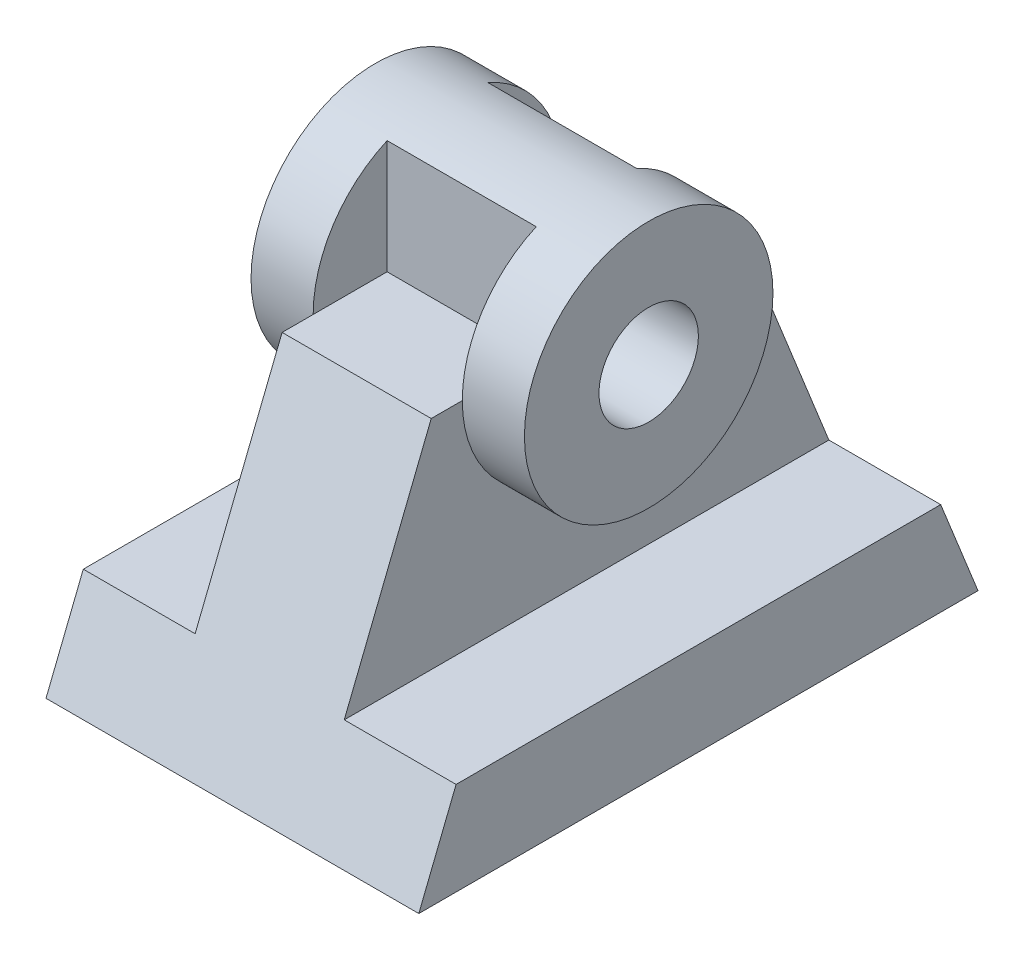
ISO-10303-21;
HEADER;
FILE_DESCRIPTION(('STEP AP214'),'2;1');
FILE_NAME('part.step','',(''),(''),'','','');
FILE_SCHEMA(('AUTOMOTIVE_DESIGN { 1 0 10303 214 1 1 1 1 }'));
ENDSEC;
DATA;
#1=APPLICATION_CONTEXT('core data for automotive mechanical design processes');
#2=APPLICATION_PROTOCOL_DEFINITION('international standard','automotive_design',2000,#1);
#3=PRODUCT_CONTEXT('',#1,'mechanical');
#4=PRODUCT('Part','Part','',(#3));
#5=PRODUCT_RELATED_PRODUCT_CATEGORY('part','',(#4));
#6=PRODUCT_DEFINITION_FORMATION('','',#4);
#7=PRODUCT_DEFINITION_CONTEXT('part definition',#1,'design');
#8=PRODUCT_DEFINITION('design','',#6,#7);
#9=PRODUCT_DEFINITION_SHAPE('','',#8);
#10=(LENGTH_UNIT() NAMED_UNIT(*) SI_UNIT(.MILLI.,.METRE.));
#11=(NAMED_UNIT(*) PLANE_ANGLE_UNIT() SI_UNIT($,.RADIAN.));
#12=(NAMED_UNIT(*) SI_UNIT($,.STERADIAN.) SOLID_ANGLE_UNIT());
#13=UNCERTAINTY_MEASURE_WITH_UNIT(LENGTH_MEASURE(1.E-05),#10,'distance_accuracy_value','');
#14=(GEOMETRIC_REPRESENTATION_CONTEXT(3) GLOBAL_UNCERTAINTY_ASSIGNED_CONTEXT((#13)) GLOBAL_UNIT_ASSIGNED_CONTEXT((#10,
#11,#12)) REPRESENTATION_CONTEXT('',''));
#15=CARTESIAN_POINT('',(0.,0.,0.));
#16=DIRECTION('',(0.,0.,1.));
#17=DIRECTION('',(1.,0.,0.));
#18=AXIS2_PLACEMENT_3D('',#15,#16,#17);
#19=CARTESIAN_POINT('',(-30.,25.,25.));
#20=DIRECTION('',(0.,1.,0.));
#21=DIRECTION('',(0.,0.,1.));
#22=AXIS2_PLACEMENT_3D('',#19,#20,#21);
#23=PLANE('',#22);
#24=DIRECTION('',(0.,0.,1.));
#25=VECTOR('',#24,1.);
#26=CARTESIAN_POINT('',(-12.,25.,-45.));
#27=LINE('',#26,#25);
#28=CARTESIAN_POINT('',(-12.,25.,-25.));
#29=VERTEX_POINT('',#28);
#30=CARTESIAN_POINT('',(-12.,25.,-20.));
#31=VERTEX_POINT('',#30);
#32=EDGE_CURVE('E189',#29,#31,#27,.T.);
#33=ORIENTED_EDGE('',*,*,#32,.T.);
#34=DIRECTION('',(0.,0.,-1.));
#35=VECTOR('',#34,1.);
#36=CARTESIAN_POINT('',(-12.,25.,-20.));
#37=LINE('',#36,#35);
#38=CARTESIAN_POINT('',(-12.,25.,-8.09999999999999));
#39=VERTEX_POINT('',#38);
#40=EDGE_CURVE('E144',#39,#31,#37,.T.);
#41=ORIENTED_EDGE('',*,*,#40,.F.);
#42=DIRECTION('',(-1.,0.,0.));
#43=VECTOR('',#42,1.);
#44=CARTESIAN_POINT('',(-12.,25.,-8.09999999999999));
#45=LINE('',#44,#43);
#46=CARTESIAN_POINT('',(12.,25.,-8.09999999999999));
#47=VERTEX_POINT('',#46);
#48=EDGE_CURVE('E149',#47,#39,#45,.T.);
#49=ORIENTED_EDGE('',*,*,#48,.F.);
#50=DIRECTION('',(0.,0.,1.));
#51=VECTOR('',#50,1.);
#52=CARTESIAN_POINT('',(12.,25.,-20.));
#53=LINE('',#52,#51);
#54=CARTESIAN_POINT('',(12.,25.,-20.));
#55=VERTEX_POINT('',#54);
#56=EDGE_CURVE('E52',#55,#47,#53,.T.);
#57=ORIENTED_EDGE('',*,*,#56,.F.);
#58=DIRECTION('',(0.,0.,1.));
#59=VECTOR('',#58,1.);
#60=CARTESIAN_POINT('',(12.,25.,-45.));
#61=LINE('',#60,#59);
#62=CARTESIAN_POINT('',(12.,25.,-25.));
#63=VERTEX_POINT('',#62);
#64=EDGE_CURVE('E196',#63,#55,#61,.T.);
#65=ORIENTED_EDGE('',*,*,#64,.F.);
#66=DIRECTION('',(1.,0.,0.));
#67=VECTOR('',#66,1.);
#68=CARTESIAN_POINT('',(-30.,25.,-25.));
#69=LINE('',#68,#67);
#70=EDGE_CURVE('E226',#29,#63,#69,.T.);
#71=ORIENTED_EDGE('',*,*,#70,.F.);
#72=EDGE_LOOP('',(#33,#41,#49,#57,#65,#71));
#73=FACE_BOUND('',#72,.T.);
#74=ADVANCED_FACE('F37',(#73),#23,.T.);
#75=CARTESIAN_POINT('',(12.,25.,20.));
#76=VERTEX_POINT('',#75);
#77=CARTESIAN_POINT('',(12.,25.,25.));
#78=VERTEX_POINT('',#77);
#79=EDGE_CURVE('E198',#76,#78,#61,.T.);
#80=ORIENTED_EDGE('',*,*,#79,.F.);
#81=DIRECTION('',(0.,0.,1.));
#82=VECTOR('',#81,1.);
#83=CARTESIAN_POINT('',(12.,25.,20.));
#84=LINE('',#83,#82);
#85=CARTESIAN_POINT('',(12.,25.,8.1));
#86=VERTEX_POINT('',#85);
#87=EDGE_CURVE('E171',#86,#76,#84,.T.);
#88=ORIENTED_EDGE('',*,*,#87,.F.);
#89=DIRECTION('',(1.,0.,0.));
#90=VECTOR('',#89,1.);
#91=CARTESIAN_POINT('',(-12.,25.,8.10000000000001));
#92=LINE('',#91,#90);
#93=CARTESIAN_POINT('',(-12.,25.,8.10000000000001));
#94=VERTEX_POINT('',#93);
#95=EDGE_CURVE('E174',#94,#86,#92,.T.);
#96=ORIENTED_EDGE('',*,*,#95,.F.);
#97=DIRECTION('',(0.,0.,-1.));
#98=VECTOR('',#97,1.);
#99=CARTESIAN_POINT('',(-12.,25.,20.));
#100=LINE('',#99,#98);
#101=CARTESIAN_POINT('',(-12.,25.,20.));
#102=VERTEX_POINT('',#101);
#103=EDGE_CURVE('E172',#102,#94,#100,.T.);
#104=ORIENTED_EDGE('',*,*,#103,.F.);
#105=CARTESIAN_POINT('',(-12.,25.,25.));
#106=VERTEX_POINT('',#105);
#107=EDGE_CURVE('E192',#102,#106,#27,.T.);
#108=ORIENTED_EDGE('',*,*,#107,.T.);
#109=DIRECTION('',(1.,0.,0.));
#110=VECTOR('',#109,1.);
#111=CARTESIAN_POINT('',(-30.,25.,25.));
#112=LINE('',#111,#110);
#113=EDGE_CURVE('E239',#106,#78,#112,.T.);
#114=ORIENTED_EDGE('',*,*,#113,.T.);
#115=EDGE_LOOP('',(#80,#88,#96,#104,#108,#114));
#116=FACE_BOUND('',#115,.T.);
#117=ADVANCED_FACE('F269',(#116),#23,.T.);
#118=CARTESIAN_POINT('',(-30.,-25.,-45.));
#119=DIRECTION('',(0.,0.371390676354104,-0.928476690885259));
#120=DIRECTION('',(0.,0.928476690885259,0.371390676354104));
#121=AXIS2_PLACEMENT_3D('',#118,#119,#120);
#122=PLANE('',#121);
#123=DIRECTION('',(0.,-0.928476690885259,-0.371390676354104));
#124=VECTOR('',#123,1.);
#125=CARTESIAN_POINT('',(-12.,-25.,-45.));
#126=LINE('',#125,#124);
#127=CARTESIAN_POINT('',(-12.,-10.,-39.));
#128=VERTEX_POINT('',#127);
#129=EDGE_CURVE('E214',#29,#128,#126,.T.);
#130=ORIENTED_EDGE('',*,*,#129,.F.);
#131=ORIENTED_EDGE('',*,*,#70,.T.);
#132=DIRECTION('',(0.,0.928476690885259,0.371390676354104));
#133=VECTOR('',#132,1.);
#134=CARTESIAN_POINT('',(12.,-25.,-45.));
#135=LINE('',#134,#133);
#136=CARTESIAN_POINT('',(12.,-10.,-39.));
#137=VERTEX_POINT('',#136);
#138=EDGE_CURVE('E209',#137,#63,#135,.T.);
#139=ORIENTED_EDGE('',*,*,#138,.F.);
#140=DIRECTION('',(-1.,0.,0.));
#141=VECTOR('',#140,1.);
#142=CARTESIAN_POINT('',(-30.,-10.,-39.));
#143=LINE('',#142,#141);
#144=CARTESIAN_POINT('',(30.,-10.,-39.));
#145=VERTEX_POINT('',#144);
#146=EDGE_CURVE('E202',#145,#137,#143,.T.);
#147=ORIENTED_EDGE('',*,*,#146,.F.);
#148=DIRECTION('',(0.,0.928476690885259,0.371390676354104));
#149=VECTOR('',#148,1.);
#150=CARTESIAN_POINT('',(30.,-25.,-45.));
#151=LINE('',#150,#149);
#152=CARTESIAN_POINT('',(30.,-25.,-45.));
#153=VERTEX_POINT('',#152);
#154=EDGE_CURVE('E216',#153,#145,#151,.T.);
#155=ORIENTED_EDGE('',*,*,#154,.F.);
#156=DIRECTION('',(1.,0.,0.));
#157=VECTOR('',#156,1.);
#158=CARTESIAN_POINT('',(-30.,-25.,-45.));
#159=LINE('',#158,#157);
#160=CARTESIAN_POINT('',(-30.,-25.,-45.));
#161=VERTEX_POINT('',#160);
#162=EDGE_CURVE('E233',#161,#153,#159,.T.);
#163=ORIENTED_EDGE('',*,*,#162,.F.);
#164=DIRECTION('',(0.,0.928476690885259,0.371390676354104));
#165=VECTOR('',#164,1.);
#166=CARTESIAN_POINT('',(-30.,-25.,-45.));
#167=LINE('',#166,#165);
#168=CARTESIAN_POINT('',(-30.,-10.,-39.));
#169=VERTEX_POINT('',#168);
#170=EDGE_CURVE('E217',#161,#169,#167,.T.);
#171=ORIENTED_EDGE('',*,*,#170,.T.);
#172=DIRECTION('',(-1.,0.,0.));
#173=VECTOR('',#172,1.);
#174=CARTESIAN_POINT('',(-30.,-10.,-39.));
#175=LINE('',#174,#173);
#176=EDGE_CURVE('E60',#128,#169,#175,.T.);
#177=ORIENTED_EDGE('',*,*,#176,.F.);
#178=EDGE_LOOP('',(#130,#131,#139,#147,#155,#163,#171,#177));
#179=FACE_BOUND('',#178,.T.);
#180=ADVANCED_FACE('F39',(#179),#122,.T.);
#181=CARTESIAN_POINT('',(-30.,-25.,-45.));
#182=DIRECTION('',(0.,-1.,0.));
#183=DIRECTION('',(0.,0.,-1.));
#184=AXIS2_PLACEMENT_3D('',#181,#182,#183);
#185=PLANE('',#184);
#186=DIRECTION('',(0.,0.,-1.));
#187=VECTOR('',#186,1.);
#188=CARTESIAN_POINT('',(30.,-25.,-45.));
#189=LINE('',#188,#187);
#190=CARTESIAN_POINT('',(30.,-25.,45.));
#191=VERTEX_POINT('',#190);
#192=EDGE_CURVE('E221',#191,#153,#189,.T.);
#193=ORIENTED_EDGE('',*,*,#192,.F.);
#194=DIRECTION('',(1.,0.,0.));
#195=VECTOR('',#194,1.);
#196=CARTESIAN_POINT('',(-30.,-25.,45.));
#197=LINE('',#196,#195);
#198=CARTESIAN_POINT('',(-30.,-25.,45.));
#199=VERTEX_POINT('',#198);
#200=EDGE_CURVE('E236',#199,#191,#197,.T.);
#201=ORIENTED_EDGE('',*,*,#200,.F.);
#202=DIRECTION('',(0.,0.,-1.));
#203=VECTOR('',#202,1.);
#204=CARTESIAN_POINT('',(-30.,-25.,-45.));
#205=LINE('',#204,#203);
#206=EDGE_CURVE('E223',#199,#161,#205,.T.);
#207=ORIENTED_EDGE('',*,*,#206,.T.);
#208=ORIENTED_EDGE('',*,*,#162,.T.);
#209=EDGE_LOOP('',(#193,#201,#207,#208));
#210=FACE_BOUND('',#209,.T.);
#211=ADVANCED_FACE('F293',(#210),#185,.T.);
#212=CARTESIAN_POINT('',(-30.,-25.,45.));
#213=DIRECTION('',(0.,0.371390676354103,0.928476690885259));
#214=DIRECTION('',(0.,-0.92847669088526,0.371390676354103));
#215=AXIS2_PLACEMENT_3D('',#212,#213,#214);
#216=PLANE('',#215);
#217=DIRECTION('',(0.,0.92847669088526,-0.371390676354103));
#218=VECTOR('',#217,1.);
#219=CARTESIAN_POINT('',(-12.,-25.,45.));
#220=LINE('',#219,#218);
#221=CARTESIAN_POINT('',(-12.,-10.,39.));
#222=VERTEX_POINT('',#221);
#223=EDGE_CURVE('E211',#222,#106,#220,.T.);
#224=ORIENTED_EDGE('',*,*,#223,.F.);
#225=DIRECTION('',(1.,0.,0.));
#226=VECTOR('',#225,1.);
#227=CARTESIAN_POINT('',(-30.,-10.,39.));
#228=LINE('',#227,#226);
#229=CARTESIAN_POINT('',(-30.,-10.,39.));
#230=VERTEX_POINT('',#229);
#231=EDGE_CURVE('E204',#230,#222,#228,.T.);
#232=ORIENTED_EDGE('',*,*,#231,.F.);
#233=DIRECTION('',(0.,-0.928476690885259,0.371390676354103));
#234=VECTOR('',#233,1.);
#235=CARTESIAN_POINT('',(-30.,-25.,45.));
#236=LINE('',#235,#234);
#237=EDGE_CURVE('E220',#230,#199,#236,.T.);
#238=ORIENTED_EDGE('',*,*,#237,.T.);
#239=ORIENTED_EDGE('',*,*,#200,.T.);
#240=DIRECTION('',(0.,-0.928476690885259,0.371390676354103));
#241=VECTOR('',#240,1.);
#242=CARTESIAN_POINT('',(30.,-25.,45.));
#243=LINE('',#242,#241);
#244=CARTESIAN_POINT('',(30.,-10.,39.));
#245=VERTEX_POINT('',#244);
#246=EDGE_CURVE('E229',#245,#191,#243,.T.);
#247=ORIENTED_EDGE('',*,*,#246,.F.);
#248=DIRECTION('',(1.,0.,0.));
#249=VECTOR('',#248,1.);
#250=CARTESIAN_POINT('',(-30.,-10.,39.));
#251=LINE('',#250,#249);
#252=CARTESIAN_POINT('',(12.,-10.,39.));
#253=VERTEX_POINT('',#252);
#254=EDGE_CURVE('E191',#253,#245,#251,.T.);
#255=ORIENTED_EDGE('',*,*,#254,.F.);
#256=DIRECTION('',(0.,-0.92847669088526,0.371390676354103));
#257=VECTOR('',#256,1.);
#258=CARTESIAN_POINT('',(12.,-25.,45.));
#259=LINE('',#258,#257);
#260=EDGE_CURVE('E207',#78,#253,#259,.T.);
#261=ORIENTED_EDGE('',*,*,#260,.F.);
#262=ORIENTED_EDGE('',*,*,#113,.F.);
#263=EDGE_LOOP('',(#224,#232,#238,#239,#247,#255,#261,#262));
#264=FACE_BOUND('',#263,.T.);
#265=ADVANCED_FACE('F276',(#264),#216,.T.);
#266=CARTESIAN_POINT('',(-30.,0.,0.));
#267=DIRECTION('',(-1.,0.,0.));
#268=DIRECTION('',(0.,0.,1.));
#269=AXIS2_PLACEMENT_3D('',#266,#267,#268);
#270=PLANE('',#269);
#271=DIRECTION('',(0.,0.,1.));
#272=VECTOR('',#271,1.);
#273=CARTESIAN_POINT('',(-30.,-10.,0.));
#274=LINE('',#273,#272);
#275=EDGE_CURVE('E246',#169,#230,#274,.T.);
#276=ORIENTED_EDGE('',*,*,#275,.F.);
#277=ORIENTED_EDGE('',*,*,#170,.F.);
#278=ORIENTED_EDGE('',*,*,#206,.F.);
#279=ORIENTED_EDGE('',*,*,#237,.F.);
#280=EDGE_LOOP('',(#276,#277,#278,#279));
#281=FACE_BOUND('',#280,.T.);
#282=ADVANCED_FACE('F297',(#281),#270,.T.);
#283=CARTESIAN_POINT('',(30.,0.,0.));
#284=DIRECTION('',(-1.,0.,0.));
#285=DIRECTION('',(0.,0.,1.));
#286=AXIS2_PLACEMENT_3D('',#283,#284,#285);
#287=PLANE('',#286);
#288=ORIENTED_EDGE('',*,*,#154,.T.);
#289=DIRECTION('',(0.,0.,1.));
#290=VECTOR('',#289,1.);
#291=CARTESIAN_POINT('',(30.,-10.,0.));
#292=LINE('',#291,#290);
#293=EDGE_CURVE('E235',#145,#245,#292,.T.);
#294=ORIENTED_EDGE('',*,*,#293,.T.);
#295=ORIENTED_EDGE('',*,*,#246,.T.);
#296=ORIENTED_EDGE('',*,*,#192,.T.);
#297=EDGE_LOOP('',(#288,#294,#295,#296));
#298=FACE_BOUND('',#297,.T.);
#299=ADVANCED_FACE('F289',(#298),#287,.F.);
#300=CARTESIAN_POINT('',(30.,-10.,-45.));
#301=DIRECTION('',(0.,-1.,0.));
#302=DIRECTION('',(1.,0.,0.));
#303=AXIS2_PLACEMENT_3D('',#300,#301,#302);
#304=PLANE('',#303);
#305=ORIENTED_EDGE('',*,*,#146,.T.);
#306=DIRECTION('',(0.,0.,1.));
#307=VECTOR('',#306,1.);
#308=CARTESIAN_POINT('',(12.,-10.,-45.));
#309=LINE('',#308,#307);
#310=EDGE_CURVE('E188',#137,#253,#309,.T.);
#311=ORIENTED_EDGE('',*,*,#310,.T.);
#312=ORIENTED_EDGE('',*,*,#254,.T.);
#313=ORIENTED_EDGE('',*,*,#293,.F.);
#314=EDGE_LOOP('',(#305,#311,#312,#313));
#315=FACE_BOUND('',#314,.T.);
#316=ADVANCED_FACE('F283',(#315),#304,.F.);
#317=CARTESIAN_POINT('',(12.,-10.,-45.));
#318=DIRECTION('',(-1.,0.,0.));
#319=DIRECTION('',(0.,-1.,0.));
#320=AXIS2_PLACEMENT_3D('',#317,#318,#319);
#321=PLANE('',#320);
#322=CARTESIAN_POINT('',(12.,25.,0.));
#323=DIRECTION('',(-1.,0.,0.));
#324=DIRECTION('',(0.,-1.,0.));
#325=AXIS2_PLACEMENT_3D('',#322,#323,#324);
#326=CIRCLE('',#325,20.);
#327=EDGE_CURVE('E183',#76,#55,#326,.F.);
#328=ORIENTED_EDGE('',*,*,#327,.F.);
#329=ORIENTED_EDGE('',*,*,#79,.T.);
#330=ORIENTED_EDGE('',*,*,#260,.T.);
#331=ORIENTED_EDGE('',*,*,#310,.F.);
#332=ORIENTED_EDGE('',*,*,#138,.T.);
#333=ORIENTED_EDGE('',*,*,#64,.T.);
#334=EDGE_LOOP('',(#328,#329,#330,#331,#332,#333));
#335=FACE_BOUND('',#334,.T.);
#336=ADVANCED_FACE('F265',(#335),#321,.F.);
#337=CARTESIAN_POINT('',(-12.,-10.,-45.));
#338=DIRECTION('',(1.,0.,0.));
#339=DIRECTION('',(0.,0.,-1.));
#340=AXIS2_PLACEMENT_3D('',#337,#338,#339);
#341=PLANE('',#340);
#342=CARTESIAN_POINT('',(-12.,25.,0.));
#343=DIRECTION('',(1.,0.,0.));
#344=DIRECTION('',(0.,0.,-1.));
#345=AXIS2_PLACEMENT_3D('',#342,#343,#344);
#346=CIRCLE('',#345,20.);
#347=EDGE_CURVE('E248',#31,#102,#346,.F.);
#348=ORIENTED_EDGE('',*,*,#347,.F.);
#349=ORIENTED_EDGE('',*,*,#32,.F.);
#350=ORIENTED_EDGE('',*,*,#129,.T.);
#351=DIRECTION('',(0.,0.,1.));
#352=VECTOR('',#351,1.);
#353=CARTESIAN_POINT('',(-12.,-10.,-45.));
#354=LINE('',#353,#352);
#355=EDGE_CURVE('E193',#128,#222,#354,.T.);
#356=ORIENTED_EDGE('',*,*,#355,.T.);
#357=ORIENTED_EDGE('',*,*,#223,.T.);
#358=ORIENTED_EDGE('',*,*,#107,.F.);
#359=EDGE_LOOP('',(#348,#349,#350,#356,#357,#358));
#360=FACE_BOUND('',#359,.T.);
#361=ADVANCED_FACE('F302',(#360),#341,.F.);
#362=CARTESIAN_POINT('',(-30.,-10.,-45.));
#363=DIRECTION('',(0.,-1.,0.));
#364=DIRECTION('',(0.,0.,-1.));
#365=AXIS2_PLACEMENT_3D('',#362,#363,#364);
#366=PLANE('',#365);
#367=ORIENTED_EDGE('',*,*,#176,.T.);
#368=ORIENTED_EDGE('',*,*,#275,.T.);
#369=ORIENTED_EDGE('',*,*,#231,.T.);
#370=ORIENTED_EDGE('',*,*,#355,.F.);
#371=EDGE_LOOP('',(#367,#368,#369,#370));
#372=FACE_BOUND('',#371,.T.);
#373=ADVANCED_FACE('F299',(#372),#366,.F.);
#374=CARTESIAN_POINT('',(22.,25.,0.));
#375=DIRECTION('',(-1.,0.,0.));
#376=DIRECTION('',(0.,0.,1.));
#377=AXIS2_PLACEMENT_3D('',#374,#375,#376);
#378=CYLINDRICAL_SURFACE('',#377,20.);
#379=CARTESIAN_POINT('',(22.,25.,0.));
#380=DIRECTION('',(1.,0.,0.));
#381=DIRECTION('',(0.,0.,-1.));
#382=AXIS2_PLACEMENT_3D('',#379,#380,#381);
#383=CIRCLE('',#382,20.);
#384=CARTESIAN_POINT('',(22.,25.,-20.));
#385=VERTEX_POINT('',#384);
#386=EDGE_CURVE('E180',#385,#385,#383,.T.);
#387=ORIENTED_EDGE('',*,*,#386,.F.);
#388=EDGE_LOOP('',(#387));
#389=FACE_BOUND('',#388,.T.);
#390=CARTESIAN_POINT('',(-22.,25.,0.));
#391=DIRECTION('',(1.,0.,0.));
#392=DIRECTION('',(0.,0.,-1.));
#393=AXIS2_PLACEMENT_3D('',#390,#391,#392);
#394=CIRCLE('',#393,20.);
#395=CARTESIAN_POINT('',(-22.,25.,-20.));
#396=VERTEX_POINT('',#395);
#397=EDGE_CURVE('E178',#396,#396,#394,.T.);
#398=ORIENTED_EDGE('',*,*,#397,.T.);
#399=EDGE_LOOP('',(#398));
#400=FACE_BOUND('',#399,.T.);
#401=DIRECTION('',(-1.,0.,0.));
#402=VECTOR('',#401,1.);
#403=CARTESIAN_POINT('',(22.,43.2863336948662,-8.09999999999998));
#404=LINE('',#403,#402);
#405=CARTESIAN_POINT('',(12.,43.2863336948662,-8.09999999999998));
#406=VERTEX_POINT('',#405);
#407=CARTESIAN_POINT('',(-12.,43.2863336948662,-8.09999999999998));
#408=VERTEX_POINT('',#407);
#409=EDGE_CURVE('E152',#406,#408,#404,.T.);
#410=ORIENTED_EDGE('',*,*,#409,.T.);
#411=CARTESIAN_POINT('',(-12.,25.,0.));
#412=DIRECTION('',(-1.,0.,0.));
#413=DIRECTION('',(0.,0.,1.));
#414=AXIS2_PLACEMENT_3D('',#411,#412,#413);
#415=CIRCLE('',#414,20.);
#416=EDGE_CURVE('E11',#408,#31,#415,.T.);
#417=ORIENTED_EDGE('',*,*,#416,.T.);
#418=ORIENTED_EDGE('',*,*,#347,.T.);
#419=CARTESIAN_POINT('',(-12.,25.,0.));
#420=DIRECTION('',(-1.,0.,0.));
#421=DIRECTION('',(0.,0.,1.));
#422=AXIS2_PLACEMENT_3D('',#419,#420,#421);
#423=CIRCLE('',#422,20.);
#424=CARTESIAN_POINT('',(-12.,43.2863336948662,8.10000000000002));
#425=VERTEX_POINT('',#424);
#426=EDGE_CURVE('E257',#102,#425,#423,.T.);
#427=ORIENTED_EDGE('',*,*,#426,.T.);
#428=DIRECTION('',(-1.,0.,0.));
#429=VECTOR('',#428,1.);
#430=CARTESIAN_POINT('',(22.,43.2863336948662,8.10000000000002));
#431=LINE('',#430,#429);
#432=CARTESIAN_POINT('',(12.,43.2863336948662,8.10000000000002));
#433=VERTEX_POINT('',#432);
#434=EDGE_CURVE('E254',#425,#433,#431,.F.);
#435=ORIENTED_EDGE('',*,*,#434,.T.);
#436=CARTESIAN_POINT('',(12.,25.,0.));
#437=DIRECTION('',(1.,0.,0.));
#438=DIRECTION('',(0.,0.,-1.));
#439=AXIS2_PLACEMENT_3D('',#436,#437,#438);
#440=CIRCLE('',#439,20.);
#441=EDGE_CURVE('E251',#433,#76,#440,.T.);
#442=ORIENTED_EDGE('',*,*,#441,.T.);
#443=ORIENTED_EDGE('',*,*,#327,.T.);
#444=CARTESIAN_POINT('',(12.,25.,0.));
#445=DIRECTION('',(1.,0.,0.));
#446=DIRECTION('',(0.,0.,-1.));
#447=AXIS2_PLACEMENT_3D('',#444,#445,#446);
#448=CIRCLE('',#447,20.);
#449=EDGE_CURVE('E45',#55,#406,#448,.T.);
#450=ORIENTED_EDGE('',*,*,#449,.T.);
#451=EDGE_LOOP('',(#410,#417,#418,#427,#435,#442,#443,#450));
#452=FACE_BOUND('',#451,.T.);
#453=ADVANCED_FACE('F261',(#389,#400,#452),#378,.T.);
#454=CARTESIAN_POINT('',(22.,25.,0.));
#455=DIRECTION('',(1.,0.,0.));
#456=DIRECTION('',(0.,0.,-1.));
#457=AXIS2_PLACEMENT_3D('',#454,#455,#456);
#458=PLANE('',#457);
#459=CARTESIAN_POINT('',(22.,25.,0.));
#460=DIRECTION('',(1.,0.,0.));
#461=DIRECTION('',(0.,0.,-1.));
#462=AXIS2_PLACEMENT_3D('',#459,#460,#461);
#463=CIRCLE('',#462,8.);
#464=CARTESIAN_POINT('',(22.,25.,-8.00000000000001));
#465=VERTEX_POINT('',#464);
#466=EDGE_CURVE('E157',#465,#465,#463,.T.);
#467=ORIENTED_EDGE('',*,*,#466,.F.);
#468=EDGE_LOOP('',(#467));
#469=FACE_BOUND('',#468,.T.);
#470=ORIENTED_EDGE('',*,*,#386,.T.);
#471=EDGE_LOOP('',(#470));
#472=FACE_BOUND('',#471,.T.);
#473=ADVANCED_FACE('F343',(#469,#472),#458,.T.);
#474=CARTESIAN_POINT('',(-22.,25.,0.));
#475=DIRECTION('',(1.,0.,0.));
#476=DIRECTION('',(0.,0.,-1.));
#477=AXIS2_PLACEMENT_3D('',#474,#475,#476);
#478=PLANE('',#477);
#479=CARTESIAN_POINT('',(-22.,25.,0.));
#480=DIRECTION('',(1.,0.,0.));
#481=DIRECTION('',(0.,0.,-1.));
#482=AXIS2_PLACEMENT_3D('',#479,#480,#481);
#483=CIRCLE('',#482,8.);
#484=CARTESIAN_POINT('',(-22.,25.,-8.00000000000001));
#485=VERTEX_POINT('',#484);
#486=EDGE_CURVE('E160',#485,#485,#483,.T.);
#487=ORIENTED_EDGE('',*,*,#486,.T.);
#488=EDGE_LOOP('',(#487));
#489=FACE_BOUND('',#488,.T.);
#490=ORIENTED_EDGE('',*,*,#397,.F.);
#491=EDGE_LOOP('',(#490));
#492=FACE_BOUND('',#491,.T.);
#493=ADVANCED_FACE('F345',(#489,#492),#478,.F.);
#494=CARTESIAN_POINT('',(-22.,25.,0.));
#495=DIRECTION('',(1.,0.,0.));
#496=DIRECTION('',(0.,0.,-1.));
#497=AXIS2_PLACEMENT_3D('',#494,#495,#496);
#498=CYLINDRICAL_SURFACE('',#497,8.);
#499=ORIENTED_EDGE('',*,*,#486,.F.);
#500=EDGE_LOOP('',(#499));
#501=FACE_BOUND('',#500,.T.);
#502=ORIENTED_EDGE('',*,*,#466,.T.);
#503=EDGE_LOOP('',(#502));
#504=FACE_BOUND('',#503,.T.);
#505=ADVANCED_FACE('F348',(#501,#504),#498,.F.);
#506=CARTESIAN_POINT('',(-12.,-1.78824369009661,20.));
#507=DIRECTION('',(-1.,0.,0.));
#508=DIRECTION('',(0.,0.,1.));
#509=AXIS2_PLACEMENT_3D('',#506,#507,#508);
#510=PLANE('',#509);
#511=ORIENTED_EDGE('',*,*,#103,.T.);
#512=DIRECTION('',(0.,1.,0.));
#513=VECTOR('',#512,1.);
#514=CARTESIAN_POINT('',(-12.,-1.78824369009661,8.1));
#515=LINE('',#514,#513);
#516=EDGE_CURVE('E168',#94,#425,#515,.T.);
#517=ORIENTED_EDGE('',*,*,#516,.T.);
#518=ORIENTED_EDGE('',*,*,#426,.F.);
#519=EDGE_LOOP('',(#511,#517,#518));
#520=FACE_BOUND('',#519,.T.);
#521=ADVANCED_FACE('F355',(#520),#510,.F.);
#522=CARTESIAN_POINT('',(-12.,-1.78824369009661,8.1));
#523=DIRECTION('',(0.,0.,-1.));
#524=DIRECTION('',(0.,1.,0.));
#525=AXIS2_PLACEMENT_3D('',#522,#523,#524);
#526=PLANE('',#525);
#527=ORIENTED_EDGE('',*,*,#516,.F.);
#528=ORIENTED_EDGE('',*,*,#95,.T.);
#529=DIRECTION('',(0.,1.,0.));
#530=VECTOR('',#529,1.);
#531=CARTESIAN_POINT('',(12.,-1.78824369009661,8.1));
#532=LINE('',#531,#530);
#533=EDGE_CURVE('E165',#86,#433,#532,.T.);
#534=ORIENTED_EDGE('',*,*,#533,.T.);
#535=ORIENTED_EDGE('',*,*,#434,.F.);
#536=EDGE_LOOP('',(#527,#528,#534,#535));
#537=FACE_BOUND('',#536,.T.);
#538=ADVANCED_FACE('F315',(#537),#526,.F.);
#539=CARTESIAN_POINT('',(12.,-1.78824369009661,20.));
#540=DIRECTION('',(1.,0.,0.));
#541=DIRECTION('',(0.,0.,-1.));
#542=AXIS2_PLACEMENT_3D('',#539,#540,#541);
#543=PLANE('',#542);
#544=ORIENTED_EDGE('',*,*,#533,.F.);
#545=ORIENTED_EDGE('',*,*,#87,.T.);
#546=ORIENTED_EDGE('',*,*,#441,.F.);
#547=EDGE_LOOP('',(#544,#545,#546));
#548=FACE_BOUND('',#547,.T.);
#549=ADVANCED_FACE('F308',(#548),#543,.F.);
#550=CARTESIAN_POINT('',(-12.,-1.7882436900966,-20.));
#551=DIRECTION('',(-1.,0.,0.));
#552=DIRECTION('',(0.,0.,1.));
#553=AXIS2_PLACEMENT_3D('',#550,#551,#552);
#554=PLANE('',#553);
#555=DIRECTION('',(0.,1.,0.));
#556=VECTOR('',#555,1.);
#557=CARTESIAN_POINT('',(-12.,-1.78824369009661,-8.1));
#558=LINE('',#557,#556);
#559=EDGE_CURVE('E153',#39,#408,#558,.T.);
#560=ORIENTED_EDGE('',*,*,#559,.F.);
#561=ORIENTED_EDGE('',*,*,#40,.T.);
#562=ORIENTED_EDGE('',*,*,#416,.F.);
#563=EDGE_LOOP('',(#560,#561,#562));
#564=FACE_BOUND('',#563,.T.);
#565=ADVANCED_FACE('F306',(#564),#554,.F.);
#566=CARTESIAN_POINT('',(12.,-1.7882436900966,-20.));
#567=DIRECTION('',(1.,0.,0.));
#568=DIRECTION('',(0.,0.,-1.));
#569=AXIS2_PLACEMENT_3D('',#566,#567,#568);
#570=PLANE('',#569);
#571=ORIENTED_EDGE('',*,*,#56,.T.);
#572=DIRECTION('',(0.,1.,0.));
#573=VECTOR('',#572,1.);
#574=CARTESIAN_POINT('',(12.,-1.78824369009661,-8.1));
#575=LINE('',#574,#573);
#576=EDGE_CURVE('E141',#47,#406,#575,.T.);
#577=ORIENTED_EDGE('',*,*,#576,.T.);
#578=ORIENTED_EDGE('',*,*,#449,.F.);
#579=EDGE_LOOP('',(#571,#577,#578));
#580=FACE_BOUND('',#579,.T.);
#581=ADVANCED_FACE('F140',(#580),#570,.F.);
#582=CARTESIAN_POINT('',(-12.,-1.78824369009661,-8.1));
#583=DIRECTION('',(0.,0.,1.));
#584=DIRECTION('',(0.,-1.,0.));
#585=AXIS2_PLACEMENT_3D('',#582,#583,#584);
#586=PLANE('',#585);
#587=ORIENTED_EDGE('',*,*,#576,.F.);
#588=ORIENTED_EDGE('',*,*,#48,.T.);
#589=ORIENTED_EDGE('',*,*,#559,.T.);
#590=ORIENTED_EDGE('',*,*,#409,.F.);
#591=EDGE_LOOP('',(#587,#588,#589,#590));
#592=FACE_BOUND('',#591,.T.);
#593=ADVANCED_FACE('F147',(#592),#586,.F.);
#594=CLOSED_SHELL('',(#74,#117,#180,#211,#265,#282,#299,#316,#336,#361,#373,#453,#473,#493,#505,
#521,#538,#549,#565,#581,#593));
#595=MANIFOLD_SOLID_BREP('B2',#594);
#596=ADVANCED_BREP_SHAPE_REPRESENTATION('',(#18,#595),#14);
#597=SHAPE_DEFINITION_REPRESENTATION(#9,#596);
ENDSEC;
END-ISO-10303-21;
